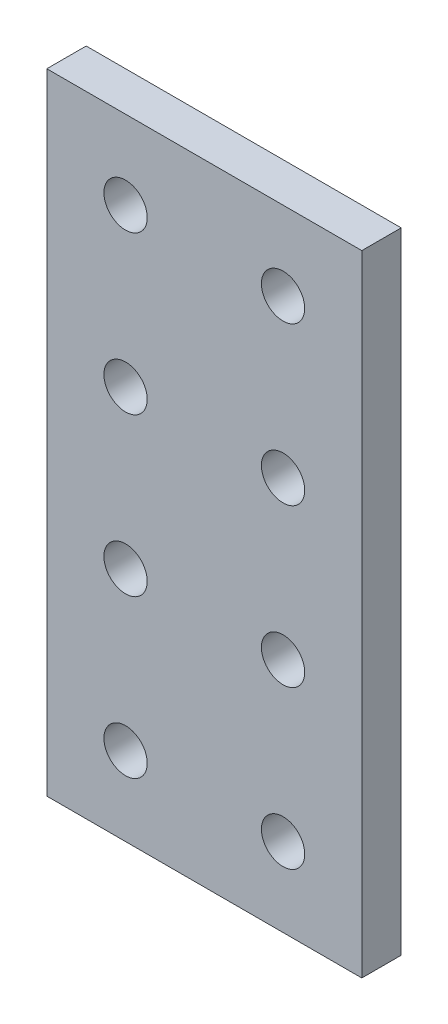
ISO-10303-21;
HEADER;
FILE_DESCRIPTION(('STEP AP214'),'2;1');
FILE_NAME('part.step','',(''),(''),'','','');
FILE_SCHEMA(('AUTOMOTIVE_DESIGN { 1 0 10303 214 1 1 1 1 }'));
ENDSEC;
DATA;
#1=APPLICATION_CONTEXT('core data for automotive mechanical design processes');
#2=APPLICATION_PROTOCOL_DEFINITION('international standard','automotive_design',2000,#1);
#3=PRODUCT_CONTEXT('',#1,'mechanical');
#4=PRODUCT('Part','Part','',(#3));
#5=PRODUCT_RELATED_PRODUCT_CATEGORY('part','',(#4));
#6=PRODUCT_DEFINITION_FORMATION('','',#4);
#7=PRODUCT_DEFINITION_CONTEXT('part definition',#1,'design');
#8=PRODUCT_DEFINITION('design','',#6,#7);
#9=PRODUCT_DEFINITION_SHAPE('','',#8);
#10=(LENGTH_UNIT() NAMED_UNIT(*) SI_UNIT(.MILLI.,.METRE.));
#11=(NAMED_UNIT(*) PLANE_ANGLE_UNIT() SI_UNIT($,.RADIAN.));
#12=(NAMED_UNIT(*) SI_UNIT($,.STERADIAN.) SOLID_ANGLE_UNIT());
#13=UNCERTAINTY_MEASURE_WITH_UNIT(LENGTH_MEASURE(1.E-05),#10,'distance_accuracy_value','');
#14=(GEOMETRIC_REPRESENTATION_CONTEXT(3) GLOBAL_UNCERTAINTY_ASSIGNED_CONTEXT((#13)) GLOBAL_UNIT_ASSIGNED_CONTEXT((#10,
#11,#12)) REPRESENTATION_CONTEXT('',''));
#15=CARTESIAN_POINT('',(0.,0.,0.));
#16=DIRECTION('',(0.,0.,1.));
#17=DIRECTION('',(1.,0.,0.));
#18=AXIS2_PLACEMENT_3D('',#15,#16,#17);
#19=CARTESIAN_POINT('',(0.,0.,5.));
#20=DIRECTION('',(0.,0.,1.));
#21=DIRECTION('',(1.,0.,0.));
#22=AXIS2_PLACEMENT_3D('',#19,#20,#21);
#23=PLANE('',#22);
#24=CARTESIAN_POINT('',(-50.3498931623927,-30.5555555555556,5.));
#25=DIRECTION('',(0.,0.,1.));
#26=DIRECTION('',(1.,0.,0.));
#27=AXIS2_PLACEMENT_3D('',#24,#25,#26);
#28=CIRCLE('',#27,2.75);
#29=CARTESIAN_POINT('',(-47.5998931623927,-30.5555555555556,5.));
#30=VERTEX_POINT('',#29);
#31=EDGE_CURVE('E149',#30,#30,#28,.T.);
#32=ORIENTED_EDGE('',*,*,#31,.F.);
#33=EDGE_LOOP('',(#32));
#34=FACE_BOUND('',#33,.T.);
#35=CARTESIAN_POINT('',(-30.3498931623925,-50.5555555555556,5.));
#36=DIRECTION('',(0.,0.,1.));
#37=DIRECTION('',(1.,0.,0.));
#38=AXIS2_PLACEMENT_3D('',#35,#36,#37);
#39=CIRCLE('',#38,2.75);
#40=CARTESIAN_POINT('',(-27.5998931623925,-50.5555555555556,5.));
#41=VERTEX_POINT('',#40);
#42=EDGE_CURVE('E137',#41,#41,#39,.T.);
#43=ORIENTED_EDGE('',*,*,#42,.F.);
#44=EDGE_LOOP('',(#43));
#45=FACE_BOUND('',#44,.T.);
#46=CARTESIAN_POINT('',(-30.3498931623929,-10.5555555555556,5.));
#47=DIRECTION('',(0.,0.,1.));
#48=DIRECTION('',(1.,0.,0.));
#49=AXIS2_PLACEMENT_3D('',#46,#47,#48);
#50=CIRCLE('',#49,2.75);
#51=CARTESIAN_POINT('',(-27.5998931623929,-10.5555555555556,5.));
#52=VERTEX_POINT('',#51);
#53=EDGE_CURVE('E125',#52,#52,#50,.T.);
#54=ORIENTED_EDGE('',*,*,#53,.F.);
#55=EDGE_LOOP('',(#54));
#56=FACE_BOUND('',#55,.T.);
#57=CARTESIAN_POINT('',(-50.3498931623931,9.44444444444445,5.));
#58=DIRECTION('',(0.,0.,1.));
#59=DIRECTION('',(1.,0.,0.));
#60=AXIS2_PLACEMENT_3D('',#57,#58,#59);
#61=CIRCLE('',#60,2.75);
#62=CARTESIAN_POINT('',(-47.5998931623931,9.44444444444445,5.));
#63=VERTEX_POINT('',#62);
#64=EDGE_CURVE('E104',#63,#63,#61,.T.);
#65=ORIENTED_EDGE('',*,*,#64,.F.);
#66=EDGE_LOOP('',(#65));
#67=FACE_BOUND('',#66,.T.);
#68=DIRECTION('',(0.,-1.,0.));
#69=VECTOR('',#68,1.);
#70=CARTESIAN_POINT('',(-60.3498931623931,19.4444444444444,5.));
#71=LINE('',#70,#69);
#72=CARTESIAN_POINT('',(-60.3498931623931,19.4444444444444,5.));
#73=VERTEX_POINT('',#72);
#74=CARTESIAN_POINT('',(-60.3498931623931,-60.5555555555556,5.));
#75=VERTEX_POINT('',#74);
#76=EDGE_CURVE('E89',#73,#75,#71,.T.);
#77=ORIENTED_EDGE('',*,*,#76,.T.);
#78=DIRECTION('',(1.,0.,0.));
#79=VECTOR('',#78,1.);
#80=CARTESIAN_POINT('',(-60.3498931623931,-60.5555555555556,5.));
#81=LINE('',#80,#79);
#82=CARTESIAN_POINT('',(-20.3498931623931,-60.5555555555556,5.));
#83=VERTEX_POINT('',#82);
#84=EDGE_CURVE('E84',#75,#83,#81,.T.);
#85=ORIENTED_EDGE('',*,*,#84,.T.);
#86=DIRECTION('',(0.,1.,0.));
#87=VECTOR('',#86,1.);
#88=CARTESIAN_POINT('',(-20.3498931623931,19.4444444444444,5.));
#89=LINE('',#88,#87);
#90=CARTESIAN_POINT('',(-20.3498931623931,19.4444444444444,5.));
#91=VERTEX_POINT('',#90);
#92=EDGE_CURVE('E87',#83,#91,#89,.T.);
#93=ORIENTED_EDGE('',*,*,#92,.T.);
#94=DIRECTION('',(-1.,0.,0.));
#95=VECTOR('',#94,1.);
#96=CARTESIAN_POINT('',(-60.3498931623931,19.4444444444444,5.));
#97=LINE('',#96,#95);
#98=EDGE_CURVE('E54',#91,#73,#97,.T.);
#99=ORIENTED_EDGE('',*,*,#98,.T.);
#100=EDGE_LOOP('',(#77,#85,#93,#99));
#101=FACE_BOUND('',#100,.T.);
#102=CARTESIAN_POINT('',(-30.3498931623931,9.44444444444445,5.));
#103=DIRECTION('',(0.,0.,1.));
#104=DIRECTION('',(1.,0.,0.));
#105=AXIS2_PLACEMENT_3D('',#102,#103,#104);
#106=CIRCLE('',#105,2.75);
#107=CARTESIAN_POINT('',(-27.5998931623931,9.44444444444445,5.));
#108=VERTEX_POINT('',#107);
#109=EDGE_CURVE('E119',#108,#108,#106,.T.);
#110=ORIENTED_EDGE('',*,*,#109,.F.);
#111=EDGE_LOOP('',(#110));
#112=FACE_BOUND('',#111,.T.);
#113=CARTESIAN_POINT('',(-30.3498931623927,-30.5555555555556,5.));
#114=DIRECTION('',(0.,0.,1.));
#115=DIRECTION('',(1.,0.,0.));
#116=AXIS2_PLACEMENT_3D('',#113,#114,#115);
#117=CIRCLE('',#116,2.75);
#118=CARTESIAN_POINT('',(-27.5998931623927,-30.5555555555556,5.));
#119=VERTEX_POINT('',#118);
#120=EDGE_CURVE('E131',#119,#119,#117,.T.);
#121=ORIENTED_EDGE('',*,*,#120,.F.);
#122=EDGE_LOOP('',(#121));
#123=FACE_BOUND('',#122,.T.);
#124=CARTESIAN_POINT('',(-50.3498931623929,-10.5555555555556,5.));
#125=DIRECTION('',(0.,0.,1.));
#126=DIRECTION('',(1.,0.,0.));
#127=AXIS2_PLACEMENT_3D('',#124,#125,#126);
#128=CIRCLE('',#127,2.75);
#129=CARTESIAN_POINT('',(-47.5998931623929,-10.5555555555556,5.));
#130=VERTEX_POINT('',#129);
#131=EDGE_CURVE('E143',#130,#130,#128,.T.);
#132=ORIENTED_EDGE('',*,*,#131,.F.);
#133=EDGE_LOOP('',(#132));
#134=FACE_BOUND('',#133,.T.);
#135=CARTESIAN_POINT('',(-50.3498931623925,-50.5555555555556,5.));
#136=DIRECTION('',(0.,0.,1.));
#137=DIRECTION('',(1.,0.,0.));
#138=AXIS2_PLACEMENT_3D('',#135,#136,#137);
#139=CIRCLE('',#138,2.75);
#140=CARTESIAN_POINT('',(-47.5998931623925,-50.5555555555556,5.));
#141=VERTEX_POINT('',#140);
#142=EDGE_CURVE('E155',#141,#141,#139,.T.);
#143=ORIENTED_EDGE('',*,*,#142,.F.);
#144=EDGE_LOOP('',(#143));
#145=FACE_BOUND('',#144,.T.);
#146=ADVANCED_FACE('F37',(#34,#45,#56,#67,#101,#112,#123,#134,#145),#23,.T.);
#147=CARTESIAN_POINT('',(0.,0.,0.));
#148=DIRECTION('',(0.,0.,1.));
#149=DIRECTION('',(1.,0.,0.));
#150=AXIS2_PLACEMENT_3D('',#147,#148,#149);
#151=PLANE('',#150);
#152=DIRECTION('',(0.,-1.,0.));
#153=VECTOR('',#152,1.);
#154=CARTESIAN_POINT('',(-60.3498931623931,19.4444444444444,0.));
#155=LINE('',#154,#153);
#156=CARTESIAN_POINT('',(-60.3498931623931,19.4444444444444,0.));
#157=VERTEX_POINT('',#156);
#158=CARTESIAN_POINT('',(-60.3498931623931,-60.5555555555556,0.));
#159=VERTEX_POINT('',#158);
#160=EDGE_CURVE('E101',#157,#159,#155,.T.);
#161=ORIENTED_EDGE('',*,*,#160,.F.);
#162=DIRECTION('',(-1.,0.,0.));
#163=VECTOR('',#162,1.);
#164=CARTESIAN_POINT('',(-60.3498931623931,19.4444444444444,0.));
#165=LINE('',#164,#163);
#166=CARTESIAN_POINT('',(-20.3498931623931,19.4444444444444,0.));
#167=VERTEX_POINT('',#166);
#168=EDGE_CURVE('E77',#167,#157,#165,.T.);
#169=ORIENTED_EDGE('',*,*,#168,.F.);
#170=DIRECTION('',(0.,1.,0.));
#171=VECTOR('',#170,1.);
#172=CARTESIAN_POINT('',(-20.3498931623931,19.4444444444444,0.));
#173=LINE('',#172,#171);
#174=CARTESIAN_POINT('',(-20.3498931623931,-60.5555555555556,0.));
#175=VERTEX_POINT('',#174);
#176=EDGE_CURVE('E71',#175,#167,#173,.T.);
#177=ORIENTED_EDGE('',*,*,#176,.F.);
#178=DIRECTION('',(1.,0.,0.));
#179=VECTOR('',#178,1.);
#180=CARTESIAN_POINT('',(-60.3498931623931,-60.5555555555556,0.));
#181=LINE('',#180,#179);
#182=EDGE_CURVE('E93',#159,#175,#181,.T.);
#183=ORIENTED_EDGE('',*,*,#182,.F.);
#184=EDGE_LOOP('',(#161,#169,#177,#183));
#185=FACE_BOUND('',#184,.T.);
#186=CARTESIAN_POINT('',(-50.3498931623931,9.44444444444445,0.));
#187=DIRECTION('',(0.,0.,1.));
#188=DIRECTION('',(1.,0.,0.));
#189=AXIS2_PLACEMENT_3D('',#186,#187,#188);
#190=CIRCLE('',#189,2.75);
#191=CARTESIAN_POINT('',(-47.5998931623931,9.44444444444445,0.));
#192=VERTEX_POINT('',#191);
#193=EDGE_CURVE('E116',#192,#192,#190,.T.);
#194=ORIENTED_EDGE('',*,*,#193,.T.);
#195=EDGE_LOOP('',(#194));
#196=FACE_BOUND('',#195,.T.);
#197=CARTESIAN_POINT('',(-30.3498931623931,9.44444444444445,0.));
#198=DIRECTION('',(0.,0.,1.));
#199=DIRECTION('',(1.,0.,0.));
#200=AXIS2_PLACEMENT_3D('',#197,#198,#199);
#201=CIRCLE('',#200,2.75);
#202=CARTESIAN_POINT('',(-27.5998931623931,9.44444444444445,0.));
#203=VERTEX_POINT('',#202);
#204=EDGE_CURVE('E122',#203,#203,#201,.T.);
#205=ORIENTED_EDGE('',*,*,#204,.T.);
#206=EDGE_LOOP('',(#205));
#207=FACE_BOUND('',#206,.T.);
#208=CARTESIAN_POINT('',(-30.3498931623929,-10.5555555555556,0.));
#209=DIRECTION('',(0.,0.,1.));
#210=DIRECTION('',(1.,0.,0.));
#211=AXIS2_PLACEMENT_3D('',#208,#209,#210);
#212=CIRCLE('',#211,2.75);
#213=CARTESIAN_POINT('',(-27.5998931623929,-10.5555555555556,0.));
#214=VERTEX_POINT('',#213);
#215=EDGE_CURVE('E128',#214,#214,#212,.T.);
#216=ORIENTED_EDGE('',*,*,#215,.T.);
#217=EDGE_LOOP('',(#216));
#218=FACE_BOUND('',#217,.T.);
#219=CARTESIAN_POINT('',(-30.3498931623927,-30.5555555555556,0.));
#220=DIRECTION('',(0.,0.,1.));
#221=DIRECTION('',(1.,0.,0.));
#222=AXIS2_PLACEMENT_3D('',#219,#220,#221);
#223=CIRCLE('',#222,2.75);
#224=CARTESIAN_POINT('',(-27.5998931623927,-30.5555555555556,0.));
#225=VERTEX_POINT('',#224);
#226=EDGE_CURVE('E134',#225,#225,#223,.T.);
#227=ORIENTED_EDGE('',*,*,#226,.T.);
#228=EDGE_LOOP('',(#227));
#229=FACE_BOUND('',#228,.T.);
#230=CARTESIAN_POINT('',(-30.3498931623925,-50.5555555555556,0.));
#231=DIRECTION('',(0.,0.,1.));
#232=DIRECTION('',(1.,0.,0.));
#233=AXIS2_PLACEMENT_3D('',#230,#231,#232);
#234=CIRCLE('',#233,2.75);
#235=CARTESIAN_POINT('',(-27.5998931623925,-50.5555555555556,0.));
#236=VERTEX_POINT('',#235);
#237=EDGE_CURVE('E140',#236,#236,#234,.T.);
#238=ORIENTED_EDGE('',*,*,#237,.T.);
#239=EDGE_LOOP('',(#238));
#240=FACE_BOUND('',#239,.T.);
#241=CARTESIAN_POINT('',(-50.3498931623929,-10.5555555555556,0.));
#242=DIRECTION('',(0.,0.,1.));
#243=DIRECTION('',(1.,0.,0.));
#244=AXIS2_PLACEMENT_3D('',#241,#242,#243);
#245=CIRCLE('',#244,2.75);
#246=CARTESIAN_POINT('',(-47.5998931623929,-10.5555555555556,0.));
#247=VERTEX_POINT('',#246);
#248=EDGE_CURVE('E146',#247,#247,#245,.T.);
#249=ORIENTED_EDGE('',*,*,#248,.T.);
#250=EDGE_LOOP('',(#249));
#251=FACE_BOUND('',#250,.T.);
#252=CARTESIAN_POINT('',(-50.3498931623927,-30.5555555555556,0.));
#253=DIRECTION('',(0.,0.,1.));
#254=DIRECTION('',(1.,0.,0.));
#255=AXIS2_PLACEMENT_3D('',#252,#253,#254);
#256=CIRCLE('',#255,2.75);
#257=CARTESIAN_POINT('',(-47.5998931623927,-30.5555555555556,0.));
#258=VERTEX_POINT('',#257);
#259=EDGE_CURVE('E152',#258,#258,#256,.T.);
#260=ORIENTED_EDGE('',*,*,#259,.T.);
#261=EDGE_LOOP('',(#260));
#262=FACE_BOUND('',#261,.T.);
#263=CARTESIAN_POINT('',(-50.3498931623925,-50.5555555555556,0.));
#264=DIRECTION('',(0.,0.,1.));
#265=DIRECTION('',(1.,0.,0.));
#266=AXIS2_PLACEMENT_3D('',#263,#264,#265);
#267=CIRCLE('',#266,2.75);
#268=CARTESIAN_POINT('',(-47.5998931623925,-50.5555555555556,0.));
#269=VERTEX_POINT('',#268);
#270=EDGE_CURVE('E158',#269,#269,#267,.T.);
#271=ORIENTED_EDGE('',*,*,#270,.T.);
#272=EDGE_LOOP('',(#271));
#273=FACE_BOUND('',#272,.T.);
#274=ADVANCED_FACE('F112',(#185,#196,#207,#218,#229,#240,#251,#262,#273),#151,.F.);
#275=CARTESIAN_POINT('',(-60.3498931623931,19.4444444444444,5.));
#276=DIRECTION('',(1.,0.,0.));
#277=DIRECTION('',(0.,0.,-1.));
#278=AXIS2_PLACEMENT_3D('',#275,#276,#277);
#279=PLANE('',#278);
#280=ORIENTED_EDGE('',*,*,#160,.T.);
#281=DIRECTION('',(0.,0.,-1.));
#282=VECTOR('',#281,1.);
#283=CARTESIAN_POINT('',(-60.3498931623931,-60.5555555555556,5.));
#284=LINE('',#283,#282);
#285=EDGE_CURVE('E11',#75,#159,#284,.T.);
#286=ORIENTED_EDGE('',*,*,#285,.F.);
#287=ORIENTED_EDGE('',*,*,#76,.F.);
#288=DIRECTION('',(0.,0.,-1.));
#289=VECTOR('',#288,1.);
#290=CARTESIAN_POINT('',(-60.3498931623931,19.4444444444444,5.));
#291=LINE('',#290,#289);
#292=EDGE_CURVE('E97',#73,#157,#291,.T.);
#293=ORIENTED_EDGE('',*,*,#292,.T.);
#294=EDGE_LOOP('',(#280,#286,#287,#293));
#295=FACE_BOUND('',#294,.T.);
#296=ADVANCED_FACE('F39',(#295),#279,.F.);
#297=CARTESIAN_POINT('',(-60.3498931623931,-60.5555555555556,5.));
#298=DIRECTION('',(0.,1.,0.));
#299=DIRECTION('',(0.,0.,1.));
#300=AXIS2_PLACEMENT_3D('',#297,#298,#299);
#301=PLANE('',#300);
#302=ORIENTED_EDGE('',*,*,#182,.T.);
#303=DIRECTION('',(0.,0.,-1.));
#304=VECTOR('',#303,1.);
#305=CARTESIAN_POINT('',(-20.3498931623931,-60.5555555555556,5.));
#306=LINE('',#305,#304);
#307=EDGE_CURVE('E46',#83,#175,#306,.T.);
#308=ORIENTED_EDGE('',*,*,#307,.F.);
#309=ORIENTED_EDGE('',*,*,#84,.F.);
#310=ORIENTED_EDGE('',*,*,#285,.T.);
#311=EDGE_LOOP('',(#302,#308,#309,#310));
#312=FACE_BOUND('',#311,.T.);
#313=ADVANCED_FACE('F92',(#312),#301,.F.);
#314=CARTESIAN_POINT('',(-20.3498931623931,19.4444444444444,5.));
#315=DIRECTION('',(-1.,0.,0.));
#316=DIRECTION('',(0.,0.,1.));
#317=AXIS2_PLACEMENT_3D('',#314,#315,#316);
#318=PLANE('',#317);
#319=ORIENTED_EDGE('',*,*,#176,.T.);
#320=DIRECTION('',(0.,0.,-1.));
#321=VECTOR('',#320,1.);
#322=CARTESIAN_POINT('',(-20.3498931623931,19.4444444444444,5.));
#323=LINE('',#322,#321);
#324=EDGE_CURVE('E94',#91,#167,#323,.T.);
#325=ORIENTED_EDGE('',*,*,#324,.F.);
#326=ORIENTED_EDGE('',*,*,#92,.F.);
#327=ORIENTED_EDGE('',*,*,#307,.T.);
#328=EDGE_LOOP('',(#319,#325,#326,#327));
#329=FACE_BOUND('',#328,.T.);
#330=ADVANCED_FACE('F95',(#329),#318,.F.);
#331=CARTESIAN_POINT('',(-60.3498931623931,19.4444444444444,5.));
#332=DIRECTION('',(0.,-1.,0.));
#333=DIRECTION('',(0.,0.,-1.));
#334=AXIS2_PLACEMENT_3D('',#331,#332,#333);
#335=PLANE('',#334);
#336=ORIENTED_EDGE('',*,*,#168,.T.);
#337=ORIENTED_EDGE('',*,*,#292,.F.);
#338=ORIENTED_EDGE('',*,*,#98,.F.);
#339=ORIENTED_EDGE('',*,*,#324,.T.);
#340=EDGE_LOOP('',(#336,#337,#338,#339));
#341=FACE_BOUND('',#340,.T.);
#342=ADVANCED_FACE('F109',(#341),#335,.F.);
#343=CARTESIAN_POINT('',(-50.3498931623931,9.44444444444445,5.));
#344=DIRECTION('',(0.,0.,-1.));
#345=DIRECTION('',(-1.,0.,0.));
#346=AXIS2_PLACEMENT_3D('',#343,#344,#345);
#347=CYLINDRICAL_SURFACE('',#346,2.75);
#348=ORIENTED_EDGE('',*,*,#64,.T.);
#349=EDGE_LOOP('',(#348));
#350=FACE_BOUND('',#349,.T.);
#351=ORIENTED_EDGE('',*,*,#193,.F.);
#352=EDGE_LOOP('',(#351));
#353=FACE_BOUND('',#352,.T.);
#354=ADVANCED_FACE('F177',(#350,#353),#347,.F.);
#355=CARTESIAN_POINT('',(-30.3498931623931,9.44444444444445,5.));
#356=DIRECTION('',(0.,0.,-1.));
#357=DIRECTION('',(-1.,0.,0.));
#358=AXIS2_PLACEMENT_3D('',#355,#356,#357);
#359=CYLINDRICAL_SURFACE('',#358,2.75);
#360=ORIENTED_EDGE('',*,*,#109,.T.);
#361=EDGE_LOOP('',(#360));
#362=FACE_BOUND('',#361,.T.);
#363=ORIENTED_EDGE('',*,*,#204,.F.);
#364=EDGE_LOOP('',(#363));
#365=FACE_BOUND('',#364,.T.);
#366=ADVANCED_FACE('F223',(#362,#365),#359,.F.);
#367=CARTESIAN_POINT('',(-30.3498931623929,-10.5555555555556,5.));
#368=DIRECTION('',(0.,0.,-1.));
#369=DIRECTION('',(-1.,0.,0.));
#370=AXIS2_PLACEMENT_3D('',#367,#368,#369);
#371=CYLINDRICAL_SURFACE('',#370,2.75);
#372=ORIENTED_EDGE('',*,*,#53,.T.);
#373=EDGE_LOOP('',(#372));
#374=FACE_BOUND('',#373,.T.);
#375=ORIENTED_EDGE('',*,*,#215,.F.);
#376=EDGE_LOOP('',(#375));
#377=FACE_BOUND('',#376,.T.);
#378=ADVANCED_FACE('F231',(#374,#377),#371,.F.);
#379=CARTESIAN_POINT('',(-30.3498931623927,-30.5555555555556,5.));
#380=DIRECTION('',(0.,0.,-1.));
#381=DIRECTION('',(-1.,0.,0.));
#382=AXIS2_PLACEMENT_3D('',#379,#380,#381);
#383=CYLINDRICAL_SURFACE('',#382,2.75);
#384=ORIENTED_EDGE('',*,*,#120,.T.);
#385=EDGE_LOOP('',(#384));
#386=FACE_BOUND('',#385,.T.);
#387=ORIENTED_EDGE('',*,*,#226,.F.);
#388=EDGE_LOOP('',(#387));
#389=FACE_BOUND('',#388,.T.);
#390=ADVANCED_FACE('F239',(#386,#389),#383,.F.);
#391=CARTESIAN_POINT('',(-30.3498931623925,-50.5555555555556,5.));
#392=DIRECTION('',(0.,0.,-1.));
#393=DIRECTION('',(-1.,0.,0.));
#394=AXIS2_PLACEMENT_3D('',#391,#392,#393);
#395=CYLINDRICAL_SURFACE('',#394,2.75);
#396=ORIENTED_EDGE('',*,*,#42,.T.);
#397=EDGE_LOOP('',(#396));
#398=FACE_BOUND('',#397,.T.);
#399=ORIENTED_EDGE('',*,*,#237,.F.);
#400=EDGE_LOOP('',(#399));
#401=FACE_BOUND('',#400,.T.);
#402=ADVANCED_FACE('F248',(#398,#401),#395,.F.);
#403=CARTESIAN_POINT('',(-50.3498931623929,-10.5555555555556,5.));
#404=DIRECTION('',(0.,0.,-1.));
#405=DIRECTION('',(-1.,0.,0.));
#406=AXIS2_PLACEMENT_3D('',#403,#404,#405);
#407=CYLINDRICAL_SURFACE('',#406,2.75);
#408=ORIENTED_EDGE('',*,*,#131,.T.);
#409=EDGE_LOOP('',(#408));
#410=FACE_BOUND('',#409,.T.);
#411=ORIENTED_EDGE('',*,*,#248,.F.);
#412=EDGE_LOOP('',(#411));
#413=FACE_BOUND('',#412,.T.);
#414=ADVANCED_FACE('F257',(#410,#413),#407,.F.);
#415=CARTESIAN_POINT('',(-50.3498931623927,-30.5555555555556,5.));
#416=DIRECTION('',(0.,0.,-1.));
#417=DIRECTION('',(-1.,0.,0.));
#418=AXIS2_PLACEMENT_3D('',#415,#416,#417);
#419=CYLINDRICAL_SURFACE('',#418,2.75);
#420=ORIENTED_EDGE('',*,*,#31,.T.);
#421=EDGE_LOOP('',(#420));
#422=FACE_BOUND('',#421,.T.);
#423=ORIENTED_EDGE('',*,*,#259,.F.);
#424=EDGE_LOOP('',(#423));
#425=FACE_BOUND('',#424,.T.);
#426=ADVANCED_FACE('F266',(#422,#425),#419,.F.);
#427=CARTESIAN_POINT('',(-50.3498931623925,-50.5555555555556,5.));
#428=DIRECTION('',(0.,0.,-1.));
#429=DIRECTION('',(-1.,0.,0.));
#430=AXIS2_PLACEMENT_3D('',#427,#428,#429);
#431=CYLINDRICAL_SURFACE('',#430,2.75);
#432=ORIENTED_EDGE('',*,*,#142,.T.);
#433=EDGE_LOOP('',(#432));
#434=FACE_BOUND('',#433,.T.);
#435=ORIENTED_EDGE('',*,*,#270,.F.);
#436=EDGE_LOOP('',(#435));
#437=FACE_BOUND('',#436,.T.);
#438=ADVANCED_FACE('F164',(#434,#437),#431,.F.);
#439=CLOSED_SHELL('',(#146,#274,#296,#313,#330,#342,#354,#366,#378,#390,#402,#414,#426,#438));
#440=MANIFOLD_SOLID_BREP('B2',#439);
#441=ADVANCED_BREP_SHAPE_REPRESENTATION('',(#18,#440),#14);
#442=SHAPE_DEFINITION_REPRESENTATION(#9,#441);
ENDSEC;
END-ISO-10303-21;
